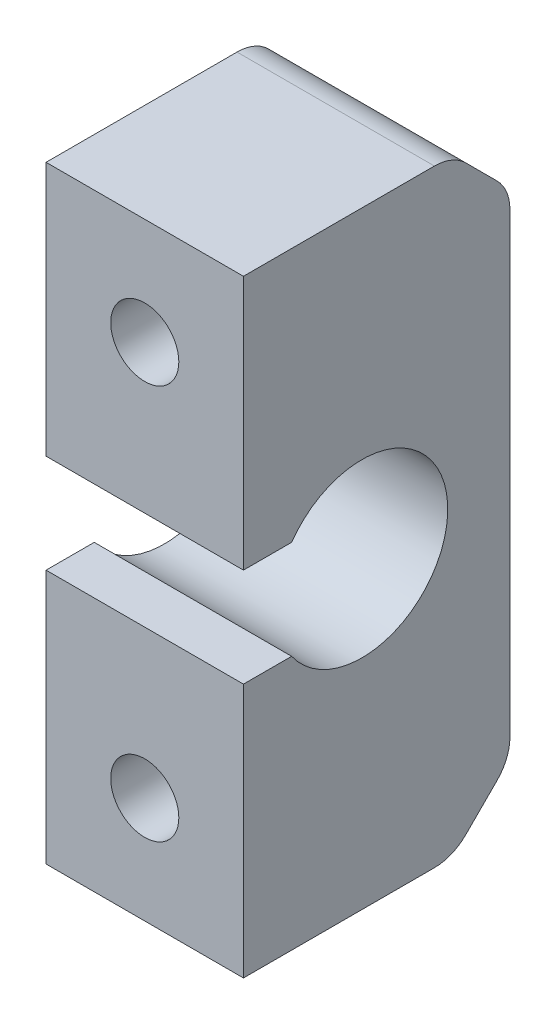
ISO-10303-21;
HEADER;
FILE_DESCRIPTION(('STEP AP214'),'2;1');
FILE_NAME('part.step','',(''),(''),'','','');
FILE_SCHEMA(('AUTOMOTIVE_DESIGN { 1 0 10303 214 1 1 1 1 }'));
ENDSEC;
DATA;
#1=APPLICATION_CONTEXT('core data for automotive mechanical design processes');
#2=APPLICATION_PROTOCOL_DEFINITION('international standard','automotive_design',2000,#1);
#3=PRODUCT_CONTEXT('',#1,'mechanical');
#4=PRODUCT('Part','Part','',(#3));
#5=PRODUCT_RELATED_PRODUCT_CATEGORY('part','',(#4));
#6=PRODUCT_DEFINITION_FORMATION('','',#4);
#7=PRODUCT_DEFINITION_CONTEXT('part definition',#1,'design');
#8=PRODUCT_DEFINITION('design','',#6,#7);
#9=PRODUCT_DEFINITION_SHAPE('','',#8);
#10=(LENGTH_UNIT() NAMED_UNIT(*) SI_UNIT(.MILLI.,.METRE.));
#11=(NAMED_UNIT(*) PLANE_ANGLE_UNIT() SI_UNIT($,.RADIAN.));
#12=(NAMED_UNIT(*) SI_UNIT($,.STERADIAN.) SOLID_ANGLE_UNIT());
#13=UNCERTAINTY_MEASURE_WITH_UNIT(LENGTH_MEASURE(1.E-05),#10,'distance_accuracy_value','');
#14=(GEOMETRIC_REPRESENTATION_CONTEXT(3) GLOBAL_UNCERTAINTY_ASSIGNED_CONTEXT((#13)) GLOBAL_UNIT_ASSIGNED_CONTEXT((#10,
#11,#12)) REPRESENTATION_CONTEXT('',''));
#15=CARTESIAN_POINT('',(0.,0.,0.));
#16=DIRECTION('',(0.,0.,1.));
#17=DIRECTION('',(1.,0.,0.));
#18=AXIS2_PLACEMENT_3D('',#15,#16,#17);
#19=CARTESIAN_POINT('',(-58.4999995231628,-16.,224.118030548096));
#20=DIRECTION('',(0.,1.,0.));
#21=DIRECTION('',(0.,0.,1.));
#22=AXIS2_PLACEMENT_3D('',#19,#20,#21);
#23=PLANE('',#22);
#24=DIRECTION('',(1.,0.,0.));
#25=VECTOR('',#24,1.);
#26=CARTESIAN_POINT('',(-40.2500022649765,-16.,231.132891934015));
#27=LINE('',#26,#25);
#28=CARTESIAN_POINT('',(-61.4999995231628,-16.,231.132891934015));
#29=VERTEX_POINT('',#28);
#30=CARTESIAN_POINT('',(-55.4999995231628,-16.,231.132891934015));
#31=VERTEX_POINT('',#30);
#32=EDGE_CURVE('E33',#29,#31,#27,.T.);
#33=ORIENTED_EDGE('',*,*,#32,.F.);
#34=DIRECTION('',(0.,0.,1.));
#35=VECTOR('',#34,1.);
#36=CARTESIAN_POINT('',(-61.4999995231628,-16.,224.118030548096));
#37=LINE('',#36,#35);
#38=CARTESIAN_POINT('',(-61.4999995231628,-16.,234.118030548096));
#39=VERTEX_POINT('',#38);
#40=EDGE_CURVE('E10',#29,#39,#37,.T.);
#41=ORIENTED_EDGE('',*,*,#40,.T.);
#42=DIRECTION('',(1.,0.,0.));
#43=VECTOR('',#42,1.);
#44=CARTESIAN_POINT('',(-58.4999995231628,-16.,234.118030548096));
#45=LINE('',#44,#43);
#46=CARTESIAN_POINT('',(-55.4999995231628,-16.,234.118030548096));
#47=VERTEX_POINT('',#46);
#48=EDGE_CURVE('E25',#39,#47,#45,.T.);
#49=ORIENTED_EDGE('',*,*,#48,.T.);
#50=DIRECTION('',(0.,0.,1.));
#51=VECTOR('',#50,1.);
#52=CARTESIAN_POINT('',(-55.4999995231628,-16.,224.118030548096));
#53=LINE('',#52,#51);
#54=EDGE_CURVE('E374',#31,#47,#53,.T.);
#55=ORIENTED_EDGE('',*,*,#54,.F.);
#56=EDGE_LOOP('',(#33,#41,#49,#55));
#57=FACE_BOUND('',#56,.T.);
#58=ADVANCED_FACE('F15',(#57),#23,.T.);
#59=CARTESIAN_POINT('',(-55.4999995231628,-13.,224.118030548096));
#60=DIRECTION('',(-1.,0.,0.));
#61=DIRECTION('',(0.,0.,-1.));
#62=AXIS2_PLACEMENT_3D('',#59,#60,#61);
#63=PLANE('',#62);
#64=CARTESIAN_POINT('',(-55.4999995231628,-14.567553961197,232.867999523163));
#65=DIRECTION('',(1.,0.,0.));
#66=DIRECTION('',(0.,-0.382683432365069,-0.923879532511295));
#67=AXIS2_PLACEMENT_3D('',#64,#65,#66);
#68=CIRCLE('',#67,2.25000000000018);
#69=CARTESIAN_POINT('',(-55.4999995231628,-14.567553961197,230.617999523163));
#70=VERTEX_POINT('',#69);
#71=EDGE_CURVE('E348',#31,#70,#68,.T.);
#72=ORIENTED_EDGE('',*,*,#71,.F.);
#73=ORIENTED_EDGE('',*,*,#54,.T.);
#74=DIRECTION('',(0.,1.,0.));
#75=VECTOR('',#74,1.);
#76=CARTESIAN_POINT('',(-55.4999995231628,-13.,234.118030548096));
#77=LINE('',#76,#75);
#78=CARTESIAN_POINT('',(-55.4999995231628,-10.0000000000001,234.118030548096));
#79=VERTEX_POINT('',#78);
#80=EDGE_CURVE('E367',#47,#79,#77,.T.);
#81=ORIENTED_EDGE('',*,*,#80,.T.);
#82=DIRECTION('',(0.,0.,1.));
#83=VECTOR('',#82,1.);
#84=CARTESIAN_POINT('',(-55.4999995231628,-10.0000000000001,224.118030548096));
#85=LINE('',#84,#83);
#86=CARTESIAN_POINT('',(-55.4999995231628,-10.0000000000001,230.617999523163));
#87=VERTEX_POINT('',#86);
#88=EDGE_CURVE('E361',#87,#79,#85,.T.);
#89=ORIENTED_EDGE('',*,*,#88,.F.);
#90=DIRECTION('',(0.,1.,0.));
#91=VECTOR('',#90,1.);
#92=CARTESIAN_POINT('',(-55.4999995231628,-8.00000000000004,230.617999523163));
#93=LINE('',#92,#91);
#94=EDGE_CURVE('E287',#70,#87,#93,.T.);
#95=ORIENTED_EDGE('',*,*,#94,.F.);
#96=EDGE_LOOP('',(#72,#73,#81,#89,#95));
#97=FACE_BOUND('',#96,.T.);
#98=ADVANCED_FACE('F387',(#97),#63,.T.);
#99=CARTESIAN_POINT('',(-58.4999995231628,-13.,236.118056032393));
#100=DIRECTION('',(0.,0.,-1.));
#101=DIRECTION('',(1.,0.,0.));
#102=AXIS2_PLACEMENT_3D('',#99,#100,#101);
#103=CYLINDRICAL_SURFACE('',#102,1.725);
#104=CARTESIAN_POINT('',(-58.4999995231628,-13.,244.118056032393));
#105=DIRECTION('',(0.,0.,-1.));
#106=DIRECTION('',(1.,0.,0.));
#107=AXIS2_PLACEMENT_3D('',#104,#105,#106);
#108=CIRCLE('',#107,1.725);
#109=CARTESIAN_POINT('',(-56.7749995231628,-13.,244.118056032393));
#110=VERTEX_POINT('',#109);
#111=EDGE_CURVE('E271',#110,#110,#108,.T.);
#112=ORIENTED_EDGE('',*,*,#111,.F.);
#113=EDGE_LOOP('',(#112));
#114=FACE_BOUND('',#113,.T.);
#115=CARTESIAN_POINT('',(-58.4999995231628,-13.,234.118030548096));
#116=DIRECTION('',(0.,0.,-1.));
#117=DIRECTION('',(1.,0.,0.));
#118=AXIS2_PLACEMENT_3D('',#115,#116,#117);
#119=CIRCLE('',#118,1.725);
#120=CARTESIAN_POINT('',(-56.7749995231628,-13.,234.118030548096));
#121=VERTEX_POINT('',#120);
#122=EDGE_CURVE('E364',#121,#121,#119,.T.);
#123=ORIENTED_EDGE('',*,*,#122,.T.);
#124=EDGE_LOOP('',(#123));
#125=FACE_BOUND('',#124,.T.);
#126=ADVANCED_FACE('F418',(#114,#125),#103,.F.);
#127=CARTESIAN_POINT('',(-58.4999995231628,-13.,234.118030548096));
#128=DIRECTION('',(0.,0.,-1.));
#129=DIRECTION('',(1.,0.,0.));
#130=AXIS2_PLACEMENT_3D('',#127,#128,#129);
#131=PLANE('',#130);
#132=ORIENTED_EDGE('',*,*,#122,.F.);
#133=EDGE_LOOP('',(#132));
#134=FACE_BOUND('',#133,.T.);
#135=ORIENTED_EDGE('',*,*,#80,.F.);
#136=ORIENTED_EDGE('',*,*,#48,.F.);
#137=DIRECTION('',(0.,-1.,0.));
#138=VECTOR('',#137,1.);
#139=CARTESIAN_POINT('',(-61.4999995231628,-13.,234.118030548096));
#140=LINE('',#139,#138);
#141=CARTESIAN_POINT('',(-61.4999995231628,-10.0000000000001,234.118030548096));
#142=VERTEX_POINT('',#141);
#143=EDGE_CURVE('E353',#142,#39,#140,.T.);
#144=ORIENTED_EDGE('',*,*,#143,.F.);
#145=DIRECTION('',(-1.,0.,0.));
#146=VECTOR('',#145,1.);
#147=CARTESIAN_POINT('',(-58.4999995231628,-10.0000000000001,234.118030548096));
#148=LINE('',#147,#146);
#149=EDGE_CURVE('E357',#79,#142,#148,.T.);
#150=ORIENTED_EDGE('',*,*,#149,.F.);
#151=EDGE_LOOP('',(#135,#136,#144,#150));
#152=FACE_BOUND('',#151,.T.);
#153=ADVANCED_FACE('F423',(#134,#152),#131,.T.);
#154=CARTESIAN_POINT('',(-58.4999995231628,-10.0000000000001,224.118030548096));
#155=DIRECTION('',(0.,-1.,0.));
#156=DIRECTION('',(0.,0.,-1.));
#157=AXIS2_PLACEMENT_3D('',#154,#155,#156);
#158=PLANE('',#157);
#159=DIRECTION('',(-1.,0.,0.));
#160=VECTOR('',#159,1.);
#161=CARTESIAN_POINT('',(-46.5000019073486,-10.0000000000001,230.617999523163));
#162=LINE('',#161,#160);
#163=CARTESIAN_POINT('',(-61.4999995231628,-10.0000000000001,230.617999523163));
#164=VERTEX_POINT('',#163);
#165=EDGE_CURVE('E281',#87,#164,#162,.T.);
#166=ORIENTED_EDGE('',*,*,#165,.F.);
#167=ORIENTED_EDGE('',*,*,#88,.T.);
#168=ORIENTED_EDGE('',*,*,#149,.T.);
#169=DIRECTION('',(0.,0.,1.));
#170=VECTOR('',#169,1.);
#171=CARTESIAN_POINT('',(-61.4999995231628,-10.0000000000001,224.118030548096));
#172=LINE('',#171,#170);
#173=EDGE_CURVE('E354',#164,#142,#172,.T.);
#174=ORIENTED_EDGE('',*,*,#173,.F.);
#175=EDGE_LOOP('',(#166,#167,#168,#174));
#176=FACE_BOUND('',#175,.T.);
#177=ADVANCED_FACE('F427',(#176),#158,.T.);
#178=CARTESIAN_POINT('',(-61.4999995231628,-13.,224.118030548096));
#179=DIRECTION('',(1.,0.,0.));
#180=DIRECTION('',(0.,0.,1.));
#181=AXIS2_PLACEMENT_3D('',#178,#179,#180);
#182=PLANE('',#181);
#183=CARTESIAN_POINT('',(-61.4999995231628,-14.567553961197,232.867999523163));
#184=DIRECTION('',(-1.,0.,0.));
#185=DIRECTION('',(0.,-0.382683432365069,-0.923879532511295));
#186=AXIS2_PLACEMENT_3D('',#183,#184,#185);
#187=CIRCLE('',#186,2.25000000000018);
#188=CARTESIAN_POINT('',(-61.4999995231628,-14.567553961197,230.617999523163));
#189=VERTEX_POINT('',#188);
#190=EDGE_CURVE('E350',#189,#29,#187,.T.);
#191=ORIENTED_EDGE('',*,*,#190,.F.);
#192=DIRECTION('',(0.,-1.,0.));
#193=VECTOR('',#192,1.);
#194=CARTESIAN_POINT('',(-61.4999995231628,-8.00000000000004,230.617999523163));
#195=LINE('',#194,#193);
#196=EDGE_CURVE('E295',#164,#189,#195,.T.);
#197=ORIENTED_EDGE('',*,*,#196,.F.);
#198=ORIENTED_EDGE('',*,*,#173,.T.);
#199=ORIENTED_EDGE('',*,*,#143,.T.);
#200=ORIENTED_EDGE('',*,*,#40,.F.);
#201=EDGE_LOOP('',(#191,#197,#198,#199,#200));
#202=FACE_BOUND('',#201,.T.);
#203=ADVANCED_FACE('F431',(#202),#182,.T.);
#204=CARTESIAN_POINT('',(-40.2500022649765,-14.567553961197,232.867999523163));
#205=DIRECTION('',(-1.,0.,0.));
#206=DIRECTION('',(0.,-0.382683432365069,-0.923879532511295));
#207=AXIS2_PLACEMENT_3D('',#204,#205,#206);
#208=CYLINDRICAL_SURFACE('',#207,2.25000000000018);
#209=ORIENTED_EDGE('',*,*,#190,.T.);
#210=ORIENTED_EDGE('',*,*,#32,.T.);
#211=ORIENTED_EDGE('',*,*,#71,.T.);
#212=DIRECTION('',(1.,0.,0.));
#213=VECTOR('',#212,1.);
#214=CARTESIAN_POINT('',(-40.2500022649765,-14.567553961197,230.617999523163));
#215=LINE('',#214,#213);
#216=CARTESIAN_POINT('',(-53.4999995231628,-14.567553961197,230.617999523163));
#217=VERTEX_POINT('',#216);
#218=EDGE_CURVE('E345',#70,#217,#215,.T.);
#219=ORIENTED_EDGE('',*,*,#218,.T.);
#220=CARTESIAN_POINT('',(-53.4999995231628,-14.567553961197,232.867999523163));
#221=DIRECTION('',(-1.,0.,0.));
#222=DIRECTION('',(0.,-0.382683432365069,-0.923879532511295));
#223=AXIS2_PLACEMENT_3D('',#220,#221,#222);
#224=CIRCLE('',#223,2.25000000000018);
#225=CARTESIAN_POINT('',(-53.4999995231628,-16.1585442188668,231.277009265493));
#226=VERTEX_POINT('',#225);
#227=EDGE_CURVE('E342',#217,#226,#224,.T.);
#228=ORIENTED_EDGE('',*,*,#227,.T.);
#229=DIRECTION('',(-1.,0.,0.));
#230=VECTOR('',#229,1.);
#231=CARTESIAN_POINT('',(-40.2500022649765,-16.1585442188668,231.277009265493));
#232=LINE('',#231,#230);
#233=CARTESIAN_POINT('',(-63.4999995231628,-16.1585442188668,231.277009265493));
#234=VERTEX_POINT('',#233);
#235=EDGE_CURVE('E339',#226,#234,#232,.T.);
#236=ORIENTED_EDGE('',*,*,#235,.T.);
#237=CARTESIAN_POINT('',(-63.4999995231628,-14.567553961197,232.867999523163));
#238=DIRECTION('',(1.,0.,0.));
#239=DIRECTION('',(0.,-0.382683432365069,-0.923879532511295));
#240=AXIS2_PLACEMENT_3D('',#237,#238,#239);
#241=CIRCLE('',#240,2.25000000000018);
#242=CARTESIAN_POINT('',(-63.4999995231628,-14.567553961197,230.617999523163));
#243=VERTEX_POINT('',#242);
#244=EDGE_CURVE('E336',#234,#243,#241,.T.);
#245=ORIENTED_EDGE('',*,*,#244,.T.);
#246=DIRECTION('',(1.,0.,0.));
#247=VECTOR('',#246,1.);
#248=CARTESIAN_POINT('',(-40.2500022649765,-14.567553961197,230.617999523163));
#249=LINE('',#248,#247);
#250=EDGE_CURVE('E332',#243,#189,#249,.T.);
#251=ORIENTED_EDGE('',*,*,#250,.T.);
#252=EDGE_LOOP('',(#209,#210,#211,#219,#228,#236,#245,#251));
#253=FACE_BOUND('',#252,.T.);
#254=ADVANCED_FACE('F381',(#253),#208,.T.);
#255=CARTESIAN_POINT('',(-58.4999995231628,3.99999999999999,224.118030548096));
#256=DIRECTION('',(0.,1.,0.));
#257=DIRECTION('',(0.,0.,1.));
#258=AXIS2_PLACEMENT_3D('',#255,#256,#257);
#259=PLANE('',#258);
#260=DIRECTION('',(1.,0.,0.));
#261=VECTOR('',#260,1.);
#262=CARTESIAN_POINT('',(-46.5000019073486,3.99999999999999,230.617999523163));
#263=LINE('',#262,#261);
#264=CARTESIAN_POINT('',(-61.4999995231628,3.99999999999999,230.617999523163));
#265=VERTEX_POINT('',#264);
#266=CARTESIAN_POINT('',(-55.4999995231628,3.99999999999999,230.617999523163));
#267=VERTEX_POINT('',#266);
#268=EDGE_CURVE('E302',#265,#267,#263,.T.);
#269=ORIENTED_EDGE('',*,*,#268,.F.);
#270=DIRECTION('',(0.,0.,1.));
#271=VECTOR('',#270,1.);
#272=CARTESIAN_POINT('',(-61.4999995231628,3.99999999999999,224.118030548096));
#273=LINE('',#272,#271);
#274=CARTESIAN_POINT('',(-61.4999995231628,3.99999999999999,234.118030548096));
#275=VERTEX_POINT('',#274);
#276=EDGE_CURVE('E329',#265,#275,#273,.T.);
#277=ORIENTED_EDGE('',*,*,#276,.T.);
#278=DIRECTION('',(1.,0.,0.));
#279=VECTOR('',#278,1.);
#280=CARTESIAN_POINT('',(-58.4999995231628,3.99999999999999,234.118030548096));
#281=LINE('',#280,#279);
#282=CARTESIAN_POINT('',(-55.4999995231628,3.99999999999999,234.118030548096));
#283=VERTEX_POINT('',#282);
#284=EDGE_CURVE('E326',#275,#283,#281,.T.);
#285=ORIENTED_EDGE('',*,*,#284,.T.);
#286=DIRECTION('',(0.,0.,1.));
#287=VECTOR('',#286,1.);
#288=CARTESIAN_POINT('',(-55.4999995231628,3.99999999999999,224.118030548096));
#289=LINE('',#288,#287);
#290=EDGE_CURVE('E322',#267,#283,#289,.T.);
#291=ORIENTED_EDGE('',*,*,#290,.F.);
#292=EDGE_LOOP('',(#269,#277,#285,#291));
#293=FACE_BOUND('',#292,.T.);
#294=ADVANCED_FACE('F438',(#293),#259,.T.);
#295=CARTESIAN_POINT('',(-55.4999995231628,6.99999999999996,224.118030548096));
#296=DIRECTION('',(-1.,0.,0.));
#297=DIRECTION('',(0.,0.,-1.));
#298=AXIS2_PLACEMENT_3D('',#295,#296,#297);
#299=PLANE('',#298);
#300=DIRECTION('',(0.,1.,0.));
#301=VECTOR('',#300,1.);
#302=CARTESIAN_POINT('',(-55.4999995231628,1.99999999999996,230.617999523163));
#303=LINE('',#302,#301);
#304=CARTESIAN_POINT('',(-55.4999995231628,8.56755396119688,230.617999523163));
#305=VERTEX_POINT('',#304);
#306=EDGE_CURVE('E286',#267,#305,#303,.T.);
#307=ORIENTED_EDGE('',*,*,#306,.F.);
#308=ORIENTED_EDGE('',*,*,#290,.T.);
#309=DIRECTION('',(0.,1.,0.));
#310=VECTOR('',#309,1.);
#311=CARTESIAN_POINT('',(-55.4999995231628,6.99999999999996,234.118030548096));
#312=LINE('',#311,#310);
#313=CARTESIAN_POINT('',(-55.4999995231628,9.99999999999993,234.118030548096));
#314=VERTEX_POINT('',#313);
#315=EDGE_CURVE('E312',#283,#314,#312,.T.);
#316=ORIENTED_EDGE('',*,*,#315,.T.);
#317=DIRECTION('',(0.,0.,1.));
#318=VECTOR('',#317,1.);
#319=CARTESIAN_POINT('',(-55.4999995231628,9.99999999999993,224.118030548096));
#320=LINE('',#319,#318);
#321=CARTESIAN_POINT('',(-55.4999995231628,9.99999999999993,231.132891934015));
#322=VERTEX_POINT('',#321);
#323=EDGE_CURVE('E313',#322,#314,#320,.T.);
#324=ORIENTED_EDGE('',*,*,#323,.F.);
#325=CARTESIAN_POINT('',(-55.4999995231628,8.56755396119688,232.867999523163));
#326=DIRECTION('',(1.,0.,0.));
#327=DIRECTION('',(0.,0.382683432365075,-0.923879532511293));
#328=AXIS2_PLACEMENT_3D('',#325,#326,#327);
#329=CIRCLE('',#328,2.25000000000018);
#330=EDGE_CURVE('E290',#305,#322,#329,.T.);
#331=ORIENTED_EDGE('',*,*,#330,.F.);
#332=EDGE_LOOP('',(#307,#308,#316,#324,#331));
#333=FACE_BOUND('',#332,.T.);
#334=ADVANCED_FACE('F441',(#333),#299,.T.);
#335=CARTESIAN_POINT('',(-58.4999995231628,6.99999999999996,234.118030548096));
#336=DIRECTION('',(0.,0.,-1.));
#337=DIRECTION('',(1.,0.,0.));
#338=AXIS2_PLACEMENT_3D('',#335,#336,#337);
#339=PLANE('',#338);
#340=ORIENTED_EDGE('',*,*,#315,.F.);
#341=ORIENTED_EDGE('',*,*,#284,.F.);
#342=DIRECTION('',(0.,-1.,0.));
#343=VECTOR('',#342,1.);
#344=CARTESIAN_POINT('',(-61.4999995231628,6.99999999999996,234.118030548096));
#345=LINE('',#344,#343);
#346=CARTESIAN_POINT('',(-61.4999995231628,9.99999999999993,234.118030548096));
#347=VERTEX_POINT('',#346);
#348=EDGE_CURVE('E307',#347,#275,#345,.T.);
#349=ORIENTED_EDGE('',*,*,#348,.F.);
#350=DIRECTION('',(-1.,0.,0.));
#351=VECTOR('',#350,1.);
#352=CARTESIAN_POINT('',(-58.4999995231628,9.99999999999993,234.118030548096));
#353=LINE('',#352,#351);
#354=EDGE_CURVE('E306',#314,#347,#353,.T.);
#355=ORIENTED_EDGE('',*,*,#354,.F.);
#356=EDGE_LOOP('',(#340,#341,#349,#355));
#357=FACE_BOUND('',#356,.T.);
#358=CARTESIAN_POINT('',(-58.4999995231628,6.99999999999996,234.118030548096));
#359=DIRECTION('',(0.,0.,1.));
#360=DIRECTION('',(1.,0.,0.));
#361=AXIS2_PLACEMENT_3D('',#358,#359,#360);
#362=CIRCLE('',#361,1.725);
#363=CARTESIAN_POINT('',(-56.7749995231628,6.99999999999996,234.118030548096));
#364=VERTEX_POINT('',#363);
#365=EDGE_CURVE('E309',#364,#364,#362,.T.);
#366=ORIENTED_EDGE('',*,*,#365,.T.);
#367=EDGE_LOOP('',(#366));
#368=FACE_BOUND('',#367,.T.);
#369=ADVANCED_FACE('F445',(#357,#368),#339,.T.);
#370=CARTESIAN_POINT('',(-58.4999995231628,9.99999999999993,224.118030548096));
#371=DIRECTION('',(0.,-1.,0.));
#372=DIRECTION('',(0.,0.,-1.));
#373=AXIS2_PLACEMENT_3D('',#370,#371,#372);
#374=PLANE('',#373);
#375=DIRECTION('',(-1.,0.,0.));
#376=VECTOR('',#375,1.);
#377=CARTESIAN_POINT('',(-40.2500022649765,9.99999999999993,231.132891934015));
#378=LINE('',#377,#376);
#379=CARTESIAN_POINT('',(-61.4999995231628,9.99999999999993,231.132891934015));
#380=VERTEX_POINT('',#379);
#381=EDGE_CURVE('E223',#322,#380,#378,.T.);
#382=ORIENTED_EDGE('',*,*,#381,.F.);
#383=ORIENTED_EDGE('',*,*,#323,.T.);
#384=ORIENTED_EDGE('',*,*,#354,.T.);
#385=DIRECTION('',(0.,0.,1.));
#386=VECTOR('',#385,1.);
#387=CARTESIAN_POINT('',(-61.4999995231628,9.99999999999993,224.118030548096));
#388=LINE('',#387,#386);
#389=EDGE_CURVE('E303',#380,#347,#388,.T.);
#390=ORIENTED_EDGE('',*,*,#389,.F.);
#391=EDGE_LOOP('',(#382,#383,#384,#390));
#392=FACE_BOUND('',#391,.T.);
#393=ADVANCED_FACE('F449',(#392),#374,.T.);
#394=CARTESIAN_POINT('',(-61.4999995231628,6.99999999999996,224.118030548096));
#395=DIRECTION('',(1.,0.,0.));
#396=DIRECTION('',(0.,0.,1.));
#397=AXIS2_PLACEMENT_3D('',#394,#395,#396);
#398=PLANE('',#397);
#399=DIRECTION('',(0.,-1.,0.));
#400=VECTOR('',#399,1.);
#401=CARTESIAN_POINT('',(-61.4999995231628,1.99999999999996,230.617999523163));
#402=LINE('',#401,#400);
#403=CARTESIAN_POINT('',(-61.4999995231628,8.56755396119688,230.617999523163));
#404=VERTEX_POINT('',#403);
#405=EDGE_CURVE('E296',#404,#265,#402,.T.);
#406=ORIENTED_EDGE('',*,*,#405,.F.);
#407=CARTESIAN_POINT('',(-61.4999995231628,8.56755396119688,232.867999523163));
#408=DIRECTION('',(-1.,0.,0.));
#409=DIRECTION('',(0.,0.382683432365075,-0.923879532511293));
#410=AXIS2_PLACEMENT_3D('',#407,#408,#409);
#411=CIRCLE('',#410,2.25000000000018);
#412=EDGE_CURVE('E235',#380,#404,#411,.T.);
#413=ORIENTED_EDGE('',*,*,#412,.F.);
#414=ORIENTED_EDGE('',*,*,#389,.T.);
#415=ORIENTED_EDGE('',*,*,#348,.T.);
#416=ORIENTED_EDGE('',*,*,#276,.F.);
#417=EDGE_LOOP('',(#406,#413,#414,#415,#416));
#418=FACE_BOUND('',#417,.T.);
#419=ADVANCED_FACE('F453',(#418),#398,.T.);
#420=CARTESIAN_POINT('',(-58.4999995231628,6.99999999999996,236.118056032393));
#421=DIRECTION('',(0.,0.,-1.));
#422=DIRECTION('',(1.,0.,0.));
#423=AXIS2_PLACEMENT_3D('',#420,#421,#422);
#424=CYLINDRICAL_SURFACE('',#423,1.725);
#425=CARTESIAN_POINT('',(-58.4999995231628,6.99999999999996,244.118056032393));
#426=DIRECTION('',(0.,0.,-1.));
#427=DIRECTION('',(1.,0.,0.));
#428=AXIS2_PLACEMENT_3D('',#425,#426,#427);
#429=CIRCLE('',#428,1.725);
#430=CARTESIAN_POINT('',(-56.7749995231628,6.99999999999996,244.118056032393));
#431=VERTEX_POINT('',#430);
#432=EDGE_CURVE('E276',#431,#431,#429,.T.);
#433=ORIENTED_EDGE('',*,*,#432,.F.);
#434=EDGE_LOOP('',(#433));
#435=FACE_BOUND('',#434,.T.);
#436=ORIENTED_EDGE('',*,*,#365,.F.);
#437=EDGE_LOOP('',(#436));
#438=FACE_BOUND('',#437,.T.);
#439=ADVANCED_FACE('F457',(#435,#438),#424,.F.);
#440=CARTESIAN_POINT('',(-34.5000042915344,-3.00000000000004,230.617999523163));
#441=DIRECTION('',(0.,0.,1.));
#442=DIRECTION('',(1.,0.,0.));
#443=AXIS2_PLACEMENT_3D('',#440,#441,#442);
#444=PLANE('',#443);
#445=ORIENTED_EDGE('',*,*,#196,.T.);
#446=ORIENTED_EDGE('',*,*,#250,.F.);
#447=DIRECTION('',(0.,1.,0.));
#448=VECTOR('',#447,1.);
#449=CARTESIAN_POINT('',(-63.4999995231628,-3.00000000000004,230.617999523163));
#450=LINE('',#449,#448);
#451=CARTESIAN_POINT('',(-63.4999995231628,8.56755396119688,230.617999523163));
#452=VERTEX_POINT('',#451);
#453=EDGE_CURVE('E292',#243,#452,#450,.T.);
#454=ORIENTED_EDGE('',*,*,#453,.T.);
#455=DIRECTION('',(-1.,0.,0.));
#456=VECTOR('',#455,1.);
#457=CARTESIAN_POINT('',(-40.2500022649765,8.56755396119688,230.617999523163));
#458=LINE('',#457,#456);
#459=EDGE_CURVE('E232',#404,#452,#458,.T.);
#460=ORIENTED_EDGE('',*,*,#459,.F.);
#461=ORIENTED_EDGE('',*,*,#405,.T.);
#462=ORIENTED_EDGE('',*,*,#268,.T.);
#463=ORIENTED_EDGE('',*,*,#306,.T.);
#464=DIRECTION('',(-1.,0.,0.));
#465=VECTOR('',#464,1.);
#466=CARTESIAN_POINT('',(-40.2500022649765,8.56755396119688,230.617999523163));
#467=LINE('',#466,#465);
#468=CARTESIAN_POINT('',(-53.4999995231628,8.56755396119688,230.617999523163));
#469=VERTEX_POINT('',#468);
#470=EDGE_CURVE('E251',#469,#305,#467,.T.);
#471=ORIENTED_EDGE('',*,*,#470,.F.);
#472=DIRECTION('',(0.,-1.,0.));
#473=VECTOR('',#472,1.);
#474=CARTESIAN_POINT('',(-53.4999995231628,-3.00000000000004,230.617999523163));
#475=LINE('',#474,#473);
#476=EDGE_CURVE('E283',#469,#217,#475,.T.);
#477=ORIENTED_EDGE('',*,*,#476,.T.);
#478=ORIENTED_EDGE('',*,*,#218,.F.);
#479=ORIENTED_EDGE('',*,*,#94,.T.);
#480=ORIENTED_EDGE('',*,*,#165,.T.);
#481=EDGE_LOOP('',(#445,#446,#454,#460,#461,#462,#463,#471,#477,#478,#479,#480));
#482=FACE_BOUND('',#481,.T.);
#483=ADVANCED_FACE('F391',(#482),#444,.F.);
#484=CARTESIAN_POINT('',(-58.4999995231628,-0.500000000000043,249.118056032393));
#485=DIRECTION('',(0.,-1.,0.));
#486=DIRECTION('',(0.,0.,-1.));
#487=AXIS2_PLACEMENT_3D('',#484,#485,#486);
#488=PLANE('',#487);
#489=DIRECTION('',(0.,0.,1.));
#490=VECTOR('',#489,1.);
#491=CARTESIAN_POINT('',(-63.4999995231628,-0.500000000000043,244.319580418858));
#492=LINE('',#491,#490);
#493=CARTESIAN_POINT('',(-63.4999995231628,-0.500000000000043,241.677901534658));
#494=VERTEX_POINT('',#493);
#495=CARTESIAN_POINT('',(-63.4999995231628,-0.500000000000043,244.118056032393));
#496=VERTEX_POINT('',#495);
#497=EDGE_CURVE('E248',#494,#496,#492,.T.);
#498=ORIENTED_EDGE('',*,*,#497,.F.);
#499=DIRECTION('',(-1.,0.,0.));
#500=VECTOR('',#499,1.);
#501=CARTESIAN_POINT('',(19.5000004768372,-0.500000000000043,241.677901534658));
#502=LINE('',#501,#500);
#503=CARTESIAN_POINT('',(-53.4999995231628,-0.500000000000043,241.677901534658));
#504=VERTEX_POINT('',#503);
#505=EDGE_CURVE('E265',#504,#494,#502,.T.);
#506=ORIENTED_EDGE('',*,*,#505,.F.);
#507=DIRECTION('',(0.,0.,-1.));
#508=VECTOR('',#507,1.);
#509=CARTESIAN_POINT('',(-53.4999995231628,-0.500000000000043,244.319580418858));
#510=LINE('',#509,#508);
#511=CARTESIAN_POINT('',(-53.4999995231628,-0.500000000000043,244.118056032393));
#512=VERTEX_POINT('',#511);
#513=EDGE_CURVE('E261',#512,#504,#510,.T.);
#514=ORIENTED_EDGE('',*,*,#513,.F.);
#515=DIRECTION('',(1.,0.,0.));
#516=VECTOR('',#515,1.);
#517=CARTESIAN_POINT('',(-57.9999978542328,-0.500000000000043,244.118056032393));
#518=LINE('',#517,#516);
#519=EDGE_CURVE('E244',#496,#512,#518,.T.);
#520=ORIENTED_EDGE('',*,*,#519,.F.);
#521=EDGE_LOOP('',(#498,#506,#514,#520));
#522=FACE_BOUND('',#521,.T.);
#523=ADVANCED_FACE('F464',(#522),#488,.T.);
#524=CARTESIAN_POINT('',(-58.4999995231628,-5.50000000000004,249.118056032393));
#525=DIRECTION('',(0.,1.,0.));
#526=DIRECTION('',(0.,0.,1.));
#527=AXIS2_PLACEMENT_3D('',#524,#525,#526);
#528=PLANE('',#527);
#529=DIRECTION('',(0.,0.,-1.));
#530=VECTOR('',#529,1.);
#531=CARTESIAN_POINT('',(-63.4999995231628,-5.50000000000004,244.319580418858));
#532=LINE('',#531,#530);
#533=CARTESIAN_POINT('',(-63.4999995231628,-5.50000000000004,244.118056032393));
#534=VERTEX_POINT('',#533);
#535=CARTESIAN_POINT('',(-63.4999995231628,-5.50000000000004,241.677901534658));
#536=VERTEX_POINT('',#535);
#537=EDGE_CURVE('E274',#534,#536,#532,.T.);
#538=ORIENTED_EDGE('',*,*,#537,.F.);
#539=DIRECTION('',(-1.,0.,0.));
#540=VECTOR('',#539,1.);
#541=CARTESIAN_POINT('',(-57.9999978542328,-5.50000000000004,244.118056032393));
#542=LINE('',#541,#540);
#543=CARTESIAN_POINT('',(-53.4999995231628,-5.50000000000004,244.118056032393));
#544=VERTEX_POINT('',#543);
#545=EDGE_CURVE('E240',#544,#534,#542,.T.);
#546=ORIENTED_EDGE('',*,*,#545,.F.);
#547=DIRECTION('',(0.,0.,1.));
#548=VECTOR('',#547,1.);
#549=CARTESIAN_POINT('',(-53.4999995231628,-5.50000000000004,244.319580418858));
#550=LINE('',#549,#548);
#551=CARTESIAN_POINT('',(-53.4999995231628,-5.50000000000004,241.677901534658));
#552=VERTEX_POINT('',#551);
#553=EDGE_CURVE('E268',#552,#544,#550,.T.);
#554=ORIENTED_EDGE('',*,*,#553,.F.);
#555=DIRECTION('',(1.,0.,0.));
#556=VECTOR('',#555,1.);
#557=CARTESIAN_POINT('',(19.5000004768372,-5.50000000000004,241.677901534658));
#558=LINE('',#557,#556);
#559=EDGE_CURVE('E260',#536,#552,#558,.T.);
#560=ORIENTED_EDGE('',*,*,#559,.F.);
#561=EDGE_LOOP('',(#538,#546,#554,#560));
#562=FACE_BOUND('',#561,.T.);
#563=ADVANCED_FACE('F467',(#562),#528,.T.);
#564=CARTESIAN_POINT('',(19.5000004768372,-3.00000000000004,238.118056032393));
#565=DIRECTION('',(1.,0.,0.));
#566=DIRECTION('',(0.,0.,-1.));
#567=AXIS2_PLACEMENT_3D('',#564,#565,#566);
#568=CYLINDRICAL_SURFACE('',#567,4.35);
#569=ORIENTED_EDGE('',*,*,#505,.T.);
#570=CARTESIAN_POINT('',(-63.4999995231628,-3.00000000000004,238.118056032393));
#571=DIRECTION('',(-1.,0.,0.));
#572=DIRECTION('',(0.,0.,-1.));
#573=AXIS2_PLACEMENT_3D('',#570,#571,#572);
#574=CIRCLE('',#573,4.35);
#575=EDGE_CURVE('E262',#494,#536,#574,.T.);
#576=ORIENTED_EDGE('',*,*,#575,.T.);
#577=ORIENTED_EDGE('',*,*,#559,.T.);
#578=CARTESIAN_POINT('',(-53.4999995231628,-3.00000000000004,238.118056032393));
#579=DIRECTION('',(1.,0.,0.));
#580=DIRECTION('',(0.,0.,-1.));
#581=AXIS2_PLACEMENT_3D('',#578,#579,#580);
#582=CIRCLE('',#581,4.35);
#583=EDGE_CURVE('E257',#552,#504,#582,.T.);
#584=ORIENTED_EDGE('',*,*,#583,.T.);
#585=EDGE_LOOP('',(#569,#576,#577,#584));
#586=FACE_BOUND('',#585,.T.);
#587=ADVANCED_FACE('F471',(#586),#568,.F.);
#588=CARTESIAN_POINT('',(-53.4999995231628,-2.99999999999997,239.521104805322));
#589=DIRECTION('',(-1.,0.,0.));
#590=DIRECTION('',(0.,0.,1.));
#591=AXIS2_PLACEMENT_3D('',#588,#589,#590);
#592=PLANE('',#591);
#593=ORIENTED_EDGE('',*,*,#513,.T.);
#594=ORIENTED_EDGE('',*,*,#583,.F.);
#595=ORIENTED_EDGE('',*,*,#553,.T.);
#596=DIRECTION('',(0.,1.,0.));
#597=VECTOR('',#596,1.);
#598=CARTESIAN_POINT('',(-53.4999995231628,-3.00000000000001,244.118056032393));
#599=LINE('',#598,#597);
#600=CARTESIAN_POINT('',(-53.4999995231628,-18.3935343461392,244.118056032393));
#601=VERTEX_POINT('',#600);
#602=EDGE_CURVE('E241',#601,#544,#599,.T.);
#603=ORIENTED_EDGE('',*,*,#602,.F.);
#604=DIRECTION('',(0.,0.,1.));
#605=VECTOR('',#604,1.);
#606=CARTESIAN_POINT('',(-53.4999995231628,-18.3935343461392,238.819580418858));
#607=LINE('',#606,#605);
#608=CARTESIAN_POINT('',(-53.4999995231628,-18.3935343461392,234.443979908105));
#609=VERTEX_POINT('',#608);
#610=EDGE_CURVE('E200',#609,#601,#607,.T.);
#611=ORIENTED_EDGE('',*,*,#610,.F.);
#612=CARTESIAN_POINT('',(-53.4999995231628,-16.143534346139,234.443979908105));
#613=DIRECTION('',(-1.,0.,0.));
#614=DIRECTION('',(0.,-0.923879532511287,-0.38268343236509));
#615=AXIS2_PLACEMENT_3D('',#612,#613,#614);
#616=CIRCLE('',#615,2.25000000000018);
#617=CARTESIAN_POINT('',(-53.4999995231628,-17.7345246038089,232.852989650435));
#618=VERTEX_POINT('',#617);
#619=EDGE_CURVE('E203',#618,#609,#616,.T.);
#620=ORIENTED_EDGE('',*,*,#619,.F.);
#621=DIRECTION('',(0.,-0.707106781186548,0.707106781186548));
#622=VECTOR('',#621,1.);
#623=CARTESIAN_POINT('',(-53.4999995231628,-13.3504271779422,228.468892224569));
#624=LINE('',#623,#622);
#625=EDGE_CURVE('E234',#226,#618,#624,.T.);
#626=ORIENTED_EDGE('',*,*,#625,.F.);
#627=ORIENTED_EDGE('',*,*,#227,.F.);
#628=ORIENTED_EDGE('',*,*,#476,.F.);
#629=CARTESIAN_POINT('',(-53.4999995231628,8.56755396119688,232.867999523163));
#630=DIRECTION('',(-1.,0.,0.));
#631=DIRECTION('',(0.,0.382683432365075,-0.923879532511293));
#632=AXIS2_PLACEMENT_3D('',#629,#630,#631);
#633=CIRCLE('',#632,2.25000000000018);
#634=CARTESIAN_POINT('',(-53.4999995231628,10.1585442188667,231.277009265493));
#635=VERTEX_POINT('',#634);
#636=EDGE_CURVE('E229',#635,#469,#633,.T.);
#637=ORIENTED_EDGE('',*,*,#636,.F.);
#638=DIRECTION('',(0.,-0.707106781186546,-0.707106781186549));
#639=VECTOR('',#638,1.);
#640=CARTESIAN_POINT('',(-53.4999995231628,7.35042717794208,228.468892224569));
#641=LINE('',#640,#639);
#642=CARTESIAN_POINT('',(-53.4999995231628,11.7345246038088,232.852989650435));
#643=VERTEX_POINT('',#642);
#644=EDGE_CURVE('E224',#643,#635,#641,.T.);
#645=ORIENTED_EDGE('',*,*,#644,.F.);
#646=CARTESIAN_POINT('',(-53.4999995231628,10.1435343461389,234.443979908105));
#647=DIRECTION('',(-1.,0.,0.));
#648=DIRECTION('',(0.,0.923879532511287,-0.38268343236509));
#649=AXIS2_PLACEMENT_3D('',#646,#647,#648);
#650=CIRCLE('',#649,2.25000000000018);
#651=CARTESIAN_POINT('',(-53.4999995231628,12.3935343461391,234.443979908105));
#652=VERTEX_POINT('',#651);
#653=EDGE_CURVE('E219',#652,#643,#650,.T.);
#654=ORIENTED_EDGE('',*,*,#653,.F.);
#655=DIRECTION('',(0.,0.,-1.));
#656=VECTOR('',#655,1.);
#657=CARTESIAN_POINT('',(-53.4999995231628,12.3935343461391,238.819580418858));
#658=LINE('',#657,#656);
#659=CARTESIAN_POINT('',(-53.4999995231628,12.3935343461391,244.118056032393));
#660=VERTEX_POINT('',#659);
#661=EDGE_CURVE('E215',#660,#652,#658,.T.);
#662=ORIENTED_EDGE('',*,*,#661,.F.);
#663=DIRECTION('',(0.,1.,0.));
#664=VECTOR('',#663,1.);
#665=CARTESIAN_POINT('',(-53.4999995231628,-3.00000000000001,244.118056032393));
#666=LINE('',#665,#664);
#667=EDGE_CURVE('E211',#512,#660,#666,.T.);
#668=ORIENTED_EDGE('',*,*,#667,.F.);
#669=EDGE_LOOP('',(#593,#594,#595,#603,#611,#620,#626,#627,#628,#637,#645,#654,#662,#668));
#670=FACE_BOUND('',#669,.T.);
#671=ADVANCED_FACE('F396',(#670),#592,.F.);
#672=CARTESIAN_POINT('',(-57.4999961853027,-3.00000000000004,244.118056032393));
#673=DIRECTION('',(0.,0.,-1.));
#674=DIRECTION('',(-1.,0.,0.));
#675=AXIS2_PLACEMENT_3D('',#672,#673,#674);
#676=PLANE('',#675);
#677=ORIENTED_EDGE('',*,*,#111,.T.);
#678=EDGE_LOOP('',(#677));
#679=FACE_BOUND('',#678,.T.);
#680=ORIENTED_EDGE('',*,*,#545,.T.);
#681=DIRECTION('',(0.,-1.,0.));
#682=VECTOR('',#681,1.);
#683=CARTESIAN_POINT('',(-63.4999995231628,-3.00000000000001,244.118056032393));
#684=LINE('',#683,#682);
#685=CARTESIAN_POINT('',(-63.4999995231628,-18.3935343461392,244.118056032393));
#686=VERTEX_POINT('',#685);
#687=EDGE_CURVE('E238',#534,#686,#684,.T.);
#688=ORIENTED_EDGE('',*,*,#687,.T.);
#689=DIRECTION('',(-1.,0.,0.));
#690=VECTOR('',#689,1.);
#691=CARTESIAN_POINT('',(-57.4999961853027,-18.3935343461392,244.118056032393));
#692=LINE('',#691,#690);
#693=EDGE_CURVE('E190',#601,#686,#692,.T.);
#694=ORIENTED_EDGE('',*,*,#693,.F.);
#695=ORIENTED_EDGE('',*,*,#602,.T.);
#696=EDGE_LOOP('',(#680,#688,#694,#695));
#697=FACE_BOUND('',#696,.T.);
#698=ADVANCED_FACE('F401',(#679,#697),#676,.F.);
#699=CARTESIAN_POINT('',(-46.0000002384186,-12.9995344765364,228.117999523163));
#700=DIRECTION('',(0.,-0.707106781186548,-0.707106781186548));
#701=DIRECTION('',(-1.,0.,0.));
#702=AXIS2_PLACEMENT_3D('',#699,#700,#701);
#703=PLANE('',#702);
#704=ORIENTED_EDGE('',*,*,#235,.F.);
#705=ORIENTED_EDGE('',*,*,#625,.T.);
#706=DIRECTION('',(1.,0.,0.));
#707=VECTOR('',#706,1.);
#708=CARTESIAN_POINT('',(-51.7499982118606,-17.7345246038089,232.852989650435));
#709=LINE('',#708,#707);
#710=CARTESIAN_POINT('',(-63.4999995231628,-17.7345246038089,232.852989650435));
#711=VERTEX_POINT('',#710);
#712=EDGE_CURVE('E191',#711,#618,#709,.T.);
#713=ORIENTED_EDGE('',*,*,#712,.F.);
#714=DIRECTION('',(0.,0.707106781186548,-0.707106781186548));
#715=VECTOR('',#714,1.);
#716=CARTESIAN_POINT('',(-63.4999995231628,-13.3504271779422,228.468892224569));
#717=LINE('',#716,#715);
#718=EDGE_CURVE('E186',#711,#234,#717,.T.);
#719=ORIENTED_EDGE('',*,*,#718,.T.);
#720=EDGE_LOOP('',(#704,#705,#713,#719));
#721=FACE_BOUND('',#720,.T.);
#722=ADVANCED_FACE('F398',(#721),#703,.T.);
#723=CARTESIAN_POINT('',(-40.2500022649765,8.56755396119688,232.867999523163));
#724=DIRECTION('',(-1.,0.,0.));
#725=DIRECTION('',(0.,0.382683432365075,-0.923879532511293));
#726=AXIS2_PLACEMENT_3D('',#723,#724,#725);
#727=CYLINDRICAL_SURFACE('',#726,2.25000000000018);
#728=ORIENTED_EDGE('',*,*,#412,.T.);
#729=ORIENTED_EDGE('',*,*,#459,.T.);
#730=CARTESIAN_POINT('',(-63.4999995231628,8.56755396119688,232.867999523163));
#731=DIRECTION('',(1.,0.,0.));
#732=DIRECTION('',(0.,0.382683432365075,-0.923879532511293));
#733=AXIS2_PLACEMENT_3D('',#730,#731,#732);
#734=CIRCLE('',#733,2.25000000000018);
#735=CARTESIAN_POINT('',(-63.4999995231628,10.1585442188667,231.277009265493));
#736=VERTEX_POINT('',#735);
#737=EDGE_CURVE('E228',#452,#736,#734,.T.);
#738=ORIENTED_EDGE('',*,*,#737,.T.);
#739=DIRECTION('',(1.,0.,0.));
#740=VECTOR('',#739,1.);
#741=CARTESIAN_POINT('',(-40.2500022649765,10.1585442188667,231.277009265493));
#742=LINE('',#741,#740);
#743=EDGE_CURVE('E225',#736,#635,#742,.T.);
#744=ORIENTED_EDGE('',*,*,#743,.T.);
#745=ORIENTED_EDGE('',*,*,#636,.T.);
#746=ORIENTED_EDGE('',*,*,#470,.T.);
#747=ORIENTED_EDGE('',*,*,#330,.T.);
#748=ORIENTED_EDGE('',*,*,#381,.T.);
#749=EDGE_LOOP('',(#728,#729,#738,#744,#745,#746,#747,#748));
#750=FACE_BOUND('',#749,.T.);
#751=ADVANCED_FACE('F400',(#750),#727,.T.);
#752=CARTESIAN_POINT('',(-46.0000002384186,6.99953447653634,228.117999523163));
#753=DIRECTION('',(0.,0.707106781186549,-0.707106781186546));
#754=DIRECTION('',(-1.,0.,0.));
#755=AXIS2_PLACEMENT_3D('',#752,#753,#754);
#756=PLANE('',#755);
#757=ORIENTED_EDGE('',*,*,#743,.F.);
#758=DIRECTION('',(0.,0.707106781186546,0.707106781186549));
#759=VECTOR('',#758,1.);
#760=CARTESIAN_POINT('',(-63.4999995231628,7.35042717794208,228.468892224569));
#761=LINE('',#760,#759);
#762=CARTESIAN_POINT('',(-63.4999995231628,11.7345246038088,232.852989650435));
#763=VERTEX_POINT('',#762);
#764=EDGE_CURVE('E220',#736,#763,#761,.T.);
#765=ORIENTED_EDGE('',*,*,#764,.T.);
#766=DIRECTION('',(-1.,0.,0.));
#767=VECTOR('',#766,1.);
#768=CARTESIAN_POINT('',(-51.7499982118606,11.7345246038088,232.852989650435));
#769=LINE('',#768,#767);
#770=EDGE_CURVE('E214',#643,#763,#769,.T.);
#771=ORIENTED_EDGE('',*,*,#770,.F.);
#772=ORIENTED_EDGE('',*,*,#644,.T.);
#773=EDGE_LOOP('',(#757,#765,#771,#772));
#774=FACE_BOUND('',#773,.T.);
#775=ADVANCED_FACE('F408',(#774),#756,.T.);
#776=CARTESIAN_POINT('',(-63.4999995231628,-2.99999999999997,239.521104805322));
#777=DIRECTION('',(-1.,0.,0.));
#778=DIRECTION('',(0.,0.,1.));
#779=AXIS2_PLACEMENT_3D('',#776,#777,#778);
#780=PLANE('',#779);
#781=ORIENTED_EDGE('',*,*,#497,.T.);
#782=DIRECTION('',(0.,-1.,0.));
#783=VECTOR('',#782,1.);
#784=CARTESIAN_POINT('',(-63.4999995231628,-3.00000000000001,244.118056032393));
#785=LINE('',#784,#783);
#786=CARTESIAN_POINT('',(-63.4999995231628,12.3935343461391,244.118056032393));
#787=VERTEX_POINT('',#786);
#788=EDGE_CURVE('E199',#787,#496,#785,.T.);
#789=ORIENTED_EDGE('',*,*,#788,.F.);
#790=DIRECTION('',(0.,0.,1.));
#791=VECTOR('',#790,1.);
#792=CARTESIAN_POINT('',(-63.4999995231628,12.3935343461391,238.819580418858));
#793=LINE('',#792,#791);
#794=CARTESIAN_POINT('',(-63.4999995231628,12.3935343461391,234.443979908105));
#795=VERTEX_POINT('',#794);
#796=EDGE_CURVE('E173',#795,#787,#793,.T.);
#797=ORIENTED_EDGE('',*,*,#796,.F.);
#798=CARTESIAN_POINT('',(-63.4999995231628,10.1435343461389,234.443979908105));
#799=DIRECTION('',(1.,0.,0.));
#800=DIRECTION('',(0.,0.923879532511287,-0.38268343236509));
#801=AXIS2_PLACEMENT_3D('',#798,#799,#800);
#802=CIRCLE('',#801,2.25000000000018);
#803=EDGE_CURVE('E205',#763,#795,#802,.T.);
#804=ORIENTED_EDGE('',*,*,#803,.F.);
#805=ORIENTED_EDGE('',*,*,#764,.F.);
#806=ORIENTED_EDGE('',*,*,#737,.F.);
#807=ORIENTED_EDGE('',*,*,#453,.F.);
#808=ORIENTED_EDGE('',*,*,#244,.F.);
#809=ORIENTED_EDGE('',*,*,#718,.F.);
#810=CARTESIAN_POINT('',(-63.4999995231628,-16.143534346139,234.443979908105));
#811=DIRECTION('',(1.,0.,0.));
#812=DIRECTION('',(0.,-0.923879532511287,-0.38268343236509));
#813=AXIS2_PLACEMENT_3D('',#810,#811,#812);
#814=CIRCLE('',#813,2.25000000000018);
#815=CARTESIAN_POINT('',(-63.4999995231628,-18.3935343461392,234.443979908105));
#816=VERTEX_POINT('',#815);
#817=EDGE_CURVE('E179',#816,#711,#814,.T.);
#818=ORIENTED_EDGE('',*,*,#817,.F.);
#819=DIRECTION('',(0.,0.,-1.));
#820=VECTOR('',#819,1.);
#821=CARTESIAN_POINT('',(-63.4999995231628,-18.3935343461392,238.819580418858));
#822=LINE('',#821,#820);
#823=EDGE_CURVE('E184',#686,#816,#822,.T.);
#824=ORIENTED_EDGE('',*,*,#823,.F.);
#825=ORIENTED_EDGE('',*,*,#687,.F.);
#826=ORIENTED_EDGE('',*,*,#537,.T.);
#827=ORIENTED_EDGE('',*,*,#575,.F.);
#828=EDGE_LOOP('',(#781,#789,#797,#804,#805,#806,#807,#808,#809,#818,#824,#825,#826,#827));
#829=FACE_BOUND('',#828,.T.);
#830=ADVANCED_FACE('F182',(#829),#780,.T.);
#831=CARTESIAN_POINT('',(-57.4999961853027,-3.00000000000004,244.118056032393));
#832=DIRECTION('',(0.,0.,-1.));
#833=DIRECTION('',(-1.,0.,0.));
#834=AXIS2_PLACEMENT_3D('',#831,#832,#833);
#835=PLANE('',#834);
#836=ORIENTED_EDGE('',*,*,#432,.T.);
#837=EDGE_LOOP('',(#836));
#838=FACE_BOUND('',#837,.T.);
#839=ORIENTED_EDGE('',*,*,#519,.T.);
#840=ORIENTED_EDGE('',*,*,#667,.T.);
#841=DIRECTION('',(-1.,0.,0.));
#842=VECTOR('',#841,1.);
#843=CARTESIAN_POINT('',(-57.4999961853027,12.3935343461391,244.118056032393));
#844=LINE('',#843,#842);
#845=EDGE_CURVE('E209',#660,#787,#844,.T.);
#846=ORIENTED_EDGE('',*,*,#845,.T.);
#847=ORIENTED_EDGE('',*,*,#788,.T.);
#848=EDGE_LOOP('',(#839,#840,#846,#847));
#849=FACE_BOUND('',#848,.T.);
#850=ADVANCED_FACE('F518',(#838,#849),#835,.F.);
#851=CARTESIAN_POINT('',(-57.4999961853027,-18.3935343461392,238.118056032393));
#852=DIRECTION('',(0.,1.,0.));
#853=DIRECTION('',(1.,0.,0.));
#854=AXIS2_PLACEMENT_3D('',#851,#852,#853);
#855=PLANE('',#854);
#856=ORIENTED_EDGE('',*,*,#823,.T.);
#857=DIRECTION('',(-1.,0.,0.));
#858=VECTOR('',#857,1.);
#859=CARTESIAN_POINT('',(-51.7499982118606,-18.3935343461392,234.443979908105));
#860=LINE('',#859,#858);
#861=EDGE_CURVE('E196',#609,#816,#860,.T.);
#862=ORIENTED_EDGE('',*,*,#861,.F.);
#863=ORIENTED_EDGE('',*,*,#610,.T.);
#864=ORIENTED_EDGE('',*,*,#693,.T.);
#865=EDGE_LOOP('',(#856,#862,#863,#864));
#866=FACE_BOUND('',#865,.T.);
#867=ADVANCED_FACE('F195',(#866),#855,.F.);
#868=CARTESIAN_POINT('',(-51.7499982118606,-16.143534346139,234.443979908105));
#869=DIRECTION('',(-1.,0.,0.));
#870=DIRECTION('',(0.,-0.923879532511287,-0.38268343236509));
#871=AXIS2_PLACEMENT_3D('',#868,#869,#870);
#872=CYLINDRICAL_SURFACE('',#871,2.25000000000018);
#873=ORIENTED_EDGE('',*,*,#817,.T.);
#874=ORIENTED_EDGE('',*,*,#712,.T.);
#875=ORIENTED_EDGE('',*,*,#619,.T.);
#876=ORIENTED_EDGE('',*,*,#861,.T.);
#877=EDGE_LOOP('',(#873,#874,#875,#876));
#878=FACE_BOUND('',#877,.T.);
#879=ADVANCED_FACE('F202',(#878),#872,.T.);
#880=CARTESIAN_POINT('',(-51.7499982118606,10.1435343461389,234.443979908105));
#881=DIRECTION('',(1.,0.,0.));
#882=DIRECTION('',(0.,0.923879532511287,-0.38268343236509));
#883=AXIS2_PLACEMENT_3D('',#880,#881,#882);
#884=CYLINDRICAL_SURFACE('',#883,2.25000000000018);
#885=ORIENTED_EDGE('',*,*,#803,.T.);
#886=DIRECTION('',(1.,0.,0.));
#887=VECTOR('',#886,1.);
#888=CARTESIAN_POINT('',(-51.7499982118606,12.3935343461391,234.443979908105));
#889=LINE('',#888,#887);
#890=EDGE_CURVE('E19',#795,#652,#889,.T.);
#891=ORIENTED_EDGE('',*,*,#890,.T.);
#892=ORIENTED_EDGE('',*,*,#653,.T.);
#893=ORIENTED_EDGE('',*,*,#770,.T.);
#894=EDGE_LOOP('',(#885,#891,#892,#893));
#895=FACE_BOUND('',#894,.T.);
#896=ADVANCED_FACE('F544',(#895),#884,.T.);
#897=CARTESIAN_POINT('',(-57.4999961853027,12.3935343461391,238.118056032393));
#898=DIRECTION('',(0.,-1.,0.));
#899=DIRECTION('',(-1.,0.,0.));
#900=AXIS2_PLACEMENT_3D('',#897,#898,#899);
#901=PLANE('',#900);
#902=ORIENTED_EDGE('',*,*,#796,.T.);
#903=ORIENTED_EDGE('',*,*,#845,.F.);
#904=ORIENTED_EDGE('',*,*,#661,.T.);
#905=ORIENTED_EDGE('',*,*,#890,.F.);
#906=EDGE_LOOP('',(#902,#903,#904,#905));
#907=FACE_BOUND('',#906,.T.);
#908=ADVANCED_FACE('F17',(#907),#901,.F.);
#909=CLOSED_SHELL('',(#58,#98,#126,#153,#177,#203,#254,#294,#334,#369,#393,#419,#439,#483,#523,
#563,#587,#671,#698,#722,#751,#775,#830,#850,#867,#879,#896,#908));
#910=MANIFOLD_SOLID_BREP('B1',#909);
#911=ADVANCED_BREP_SHAPE_REPRESENTATION('',(#18,#910),#14);
#912=SHAPE_DEFINITION_REPRESENTATION(#9,#911);
ENDSEC;
END-ISO-10303-21;
